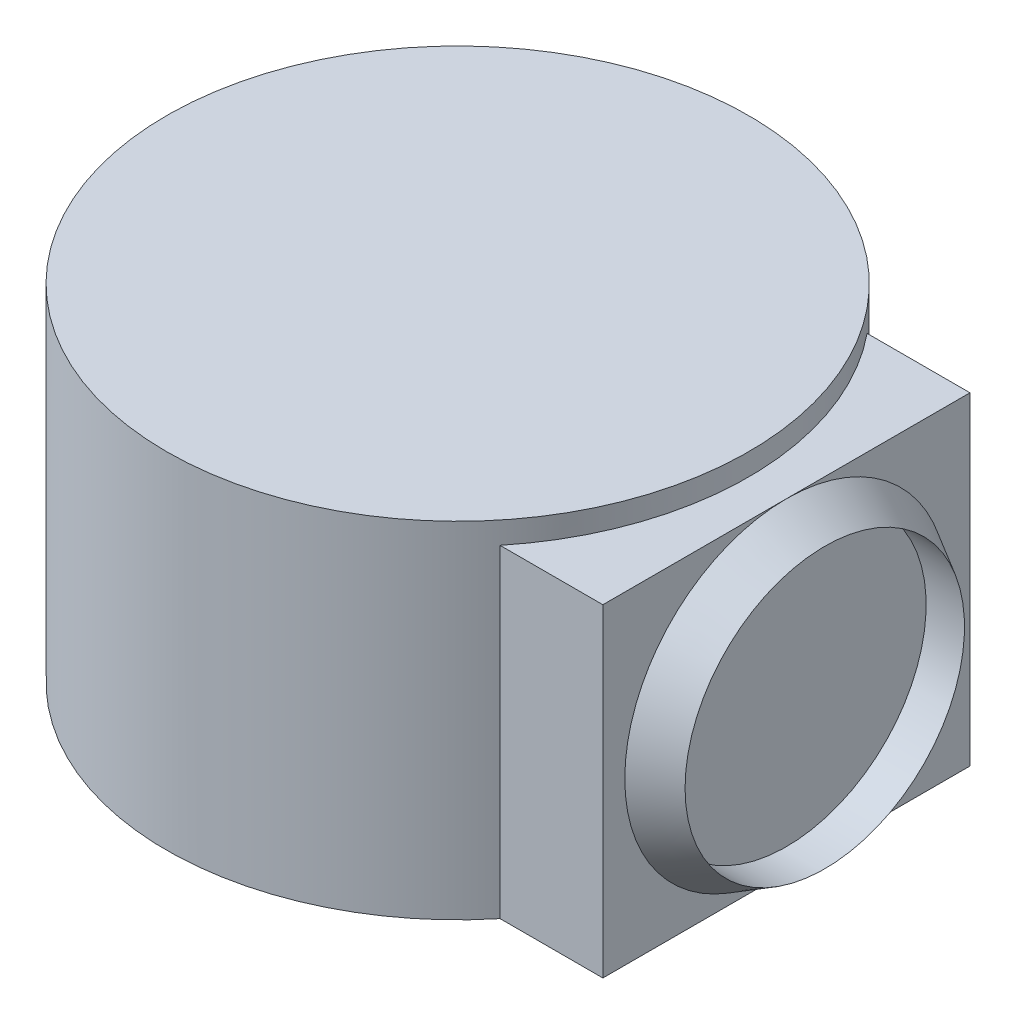
ISO-10303-21;
HEADER;
FILE_DESCRIPTION(('STEP AP214'),'2;1');
FILE_NAME('part.step','',(''),(''),'','','');
FILE_SCHEMA(('AUTOMOTIVE_DESIGN { 1 0 10303 214 1 1 1 1 }'));
ENDSEC;
DATA;
#1=APPLICATION_CONTEXT('core data for automotive mechanical design processes');
#2=APPLICATION_PROTOCOL_DEFINITION('international standard','automotive_design',2000,#1);
#3=PRODUCT_CONTEXT('',#1,'mechanical');
#4=PRODUCT('Part','Part','',(#3));
#5=PRODUCT_RELATED_PRODUCT_CATEGORY('part','',(#4));
#6=PRODUCT_DEFINITION_FORMATION('','',#4);
#7=PRODUCT_DEFINITION_CONTEXT('part definition',#1,'design');
#8=PRODUCT_DEFINITION('design','',#6,#7);
#9=PRODUCT_DEFINITION_SHAPE('','',#8);
#10=(LENGTH_UNIT() NAMED_UNIT(*) SI_UNIT(.MILLI.,.METRE.));
#11=(NAMED_UNIT(*) PLANE_ANGLE_UNIT() SI_UNIT($,.RADIAN.));
#12=(NAMED_UNIT(*) SI_UNIT($,.STERADIAN.) SOLID_ANGLE_UNIT());
#13=UNCERTAINTY_MEASURE_WITH_UNIT(LENGTH_MEASURE(1.E-05),#10,'distance_accuracy_value','');
#14=(GEOMETRIC_REPRESENTATION_CONTEXT(3) GLOBAL_UNCERTAINTY_ASSIGNED_CONTEXT((#13)) GLOBAL_UNIT_ASSIGNED_CONTEXT((#10,
#11,#12)) REPRESENTATION_CONTEXT('',''));
#15=CARTESIAN_POINT('',(0.,0.,0.));
#16=DIRECTION('',(0.,0.,1.));
#17=DIRECTION('',(1.,0.,0.));
#18=AXIS2_PLACEMENT_3D('',#15,#16,#17);
#19=CARTESIAN_POINT('',(0.,147.5,0.));
#20=DIRECTION('',(0.,1.,0.));
#21=DIRECTION('',(0.,0.,1.));
#22=AXIS2_PLACEMENT_3D('',#19,#20,#21);
#23=PLANE('',#22);
#24=DIRECTION('',(-1.,0.,0.));
#25=VECTOR('',#24,1.);
#26=CARTESIAN_POINT('',(150.,147.5,-83.75));
#27=LINE('',#26,#25);
#28=CARTESIAN_POINT('',(150.,147.5,-83.75));
#29=VERTEX_POINT('',#28);
#30=CARTESIAN_POINT('',(103.078114341746,147.5,-83.75));
#31=VERTEX_POINT('',#30);
#32=EDGE_CURVE('E108',#29,#31,#27,.T.);
#33=ORIENTED_EDGE('',*,*,#32,.T.);
#34=CARTESIAN_POINT('',(0.,147.5,0.));
#35=DIRECTION('',(0.,1.,0.));
#36=DIRECTION('',(0.,0.,1.));
#37=AXIS2_PLACEMENT_3D('',#34,#35,#36);
#38=CIRCLE('',#37,132.8125);
#39=CARTESIAN_POINT('',(103.078114341746,147.5,83.75));
#40=VERTEX_POINT('',#39);
#41=EDGE_CURVE('E103',#40,#31,#38,.T.);
#42=ORIENTED_EDGE('',*,*,#41,.F.);
#43=DIRECTION('',(-1.,0.,0.));
#44=VECTOR('',#43,1.);
#45=CARTESIAN_POINT('',(150.,147.5,83.75));
#46=LINE('',#45,#44);
#47=CARTESIAN_POINT('',(150.,147.5,83.75));
#48=VERTEX_POINT('',#47);
#49=EDGE_CURVE('E89',#48,#40,#46,.T.);
#50=ORIENTED_EDGE('',*,*,#49,.F.);
#51=DIRECTION('',(0.,0.,1.));
#52=VECTOR('',#51,1.);
#53=CARTESIAN_POINT('',(150.,147.5,-83.75));
#54=LINE('',#53,#52);
#55=CARTESIAN_POINT('',(150.,147.5,0.));
#56=VERTEX_POINT('',#55);
#57=EDGE_CURVE('E124',#56,#48,#54,.T.);
#58=ORIENTED_EDGE('',*,*,#57,.F.);
#59=EDGE_CURVE('E125',#29,#56,#54,.T.);
#60=ORIENTED_EDGE('',*,*,#59,.F.);
#61=EDGE_LOOP('',(#33,#42,#50,#58,#60));
#62=FACE_BOUND('',#61,.T.);
#63=ADVANCED_FACE('F39',(#62),#23,.T.);
#64=CARTESIAN_POINT('',(150.,0.,0.));
#65=DIRECTION('',(1.,0.,0.));
#66=DIRECTION('',(0.,0.,-1.));
#67=AXIS2_PLACEMENT_3D('',#64,#65,#66);
#68=PLANE('',#67);
#69=ORIENTED_EDGE('',*,*,#59,.T.);
#70=CARTESIAN_POINT('',(150.,73.75,0.));
#71=DIRECTION('',(-1.,0.,0.));
#72=DIRECTION('',(0.,0.,1.));
#73=AXIS2_PLACEMENT_3D('',#70,#71,#72);
#74=CIRCLE('',#73,73.75);
#75=CARTESIAN_POINT('',(150.,0.,0.));
#76=VERTEX_POINT('',#75);
#77=EDGE_CURVE('E51',#56,#76,#74,.T.);
#78=ORIENTED_EDGE('',*,*,#77,.T.);
#79=DIRECTION('',(0.,0.,-1.));
#80=VECTOR('',#79,1.);
#81=CARTESIAN_POINT('',(150.,0.,83.75));
#82=LINE('',#81,#80);
#83=CARTESIAN_POINT('',(150.,0.,-83.75));
#84=VERTEX_POINT('',#83);
#85=EDGE_CURVE('E131',#76,#84,#82,.T.);
#86=ORIENTED_EDGE('',*,*,#85,.T.);
#87=DIRECTION('',(0.,1.,0.));
#88=VECTOR('',#87,1.);
#89=CARTESIAN_POINT('',(150.,0.,-83.75));
#90=LINE('',#89,#88);
#91=EDGE_CURVE('E136',#84,#29,#90,.T.);
#92=ORIENTED_EDGE('',*,*,#91,.T.);
#93=EDGE_LOOP('',(#69,#78,#86,#92));
#94=FACE_BOUND('',#93,.T.);
#95=ADVANCED_FACE('F162',(#94),#68,.T.);
#96=CARTESIAN_POINT('',(0.,147.5,0.));
#97=DIRECTION('',(0.,-1.,0.));
#98=DIRECTION('',(0.,0.,-1.));
#99=AXIS2_PLACEMENT_3D('',#96,#97,#98);
#100=CYLINDRICAL_SURFACE('',#99,132.8125);
#101=DIRECTION('',(0.,-1.,0.));
#102=VECTOR('',#101,1.);
#103=CARTESIAN_POINT('',(103.078114341746,147.5,83.75));
#104=LINE('',#103,#102);
#105=CARTESIAN_POINT('',(103.078114341746,0.,83.75));
#106=VERTEX_POINT('',#105);
#107=EDGE_CURVE('E93',#40,#106,#104,.T.);
#108=ORIENTED_EDGE('',*,*,#107,.F.);
#109=ORIENTED_EDGE('',*,*,#41,.T.);
#110=DIRECTION('',(0.,-1.,0.));
#111=VECTOR('',#110,1.);
#112=CARTESIAN_POINT('',(103.078114341746,147.5,-83.75));
#113=LINE('',#112,#111);
#114=CARTESIAN_POINT('',(103.078114341746,0.,-83.75));
#115=VERTEX_POINT('',#114);
#116=EDGE_CURVE('E63',#115,#31,#113,.F.);
#117=ORIENTED_EDGE('',*,*,#116,.F.);
#118=CARTESIAN_POINT('',(0.,0.,0.));
#119=DIRECTION('',(0.,1.,0.));
#120=DIRECTION('',(0.,0.,1.));
#121=AXIS2_PLACEMENT_3D('',#118,#119,#120);
#122=CIRCLE('',#121,132.8125);
#123=EDGE_CURVE('E43',#115,#106,#122,.T.);
#124=ORIENTED_EDGE('',*,*,#123,.T.);
#125=EDGE_LOOP('',(#108,#109,#117,#124));
#126=FACE_BOUND('',#125,.T.);
#127=CARTESIAN_POINT('',(0.,157.5,0.));
#128=DIRECTION('',(0.,1.,0.));
#129=DIRECTION('',(0.,0.,1.));
#130=AXIS2_PLACEMENT_3D('',#127,#128,#129);
#131=CIRCLE('',#130,132.8125);
#132=CARTESIAN_POINT('',(0.,157.5,132.8125));
#133=VERTEX_POINT('',#132);
#134=EDGE_CURVE('E110',#133,#133,#131,.T.);
#135=ORIENTED_EDGE('',*,*,#134,.F.);
#136=EDGE_LOOP('',(#135));
#137=FACE_BOUND('',#136,.T.);
#138=ADVANCED_FACE('F41',(#126,#137),#100,.T.);
#139=CARTESIAN_POINT('',(0.,0.,0.));
#140=DIRECTION('',(0.,1.,0.));
#141=DIRECTION('',(0.,0.,1.));
#142=AXIS2_PLACEMENT_3D('',#139,#140,#141);
#143=PLANE('',#142);
#144=ORIENTED_EDGE('',*,*,#123,.F.);
#145=DIRECTION('',(-1.,0.,0.));
#146=VECTOR('',#145,1.);
#147=CARTESIAN_POINT('',(150.,0.,-83.75));
#148=LINE('',#147,#146);
#149=EDGE_CURVE('E141',#84,#115,#148,.T.);
#150=ORIENTED_EDGE('',*,*,#149,.F.);
#151=ORIENTED_EDGE('',*,*,#85,.F.);
#152=CARTESIAN_POINT('',(150.,0.,83.75));
#153=VERTEX_POINT('',#152);
#154=EDGE_CURVE('E132',#153,#76,#82,.T.);
#155=ORIENTED_EDGE('',*,*,#154,.F.);
#156=DIRECTION('',(-1.,0.,0.));
#157=VECTOR('',#156,1.);
#158=CARTESIAN_POINT('',(150.,0.,83.75));
#159=LINE('',#158,#157);
#160=EDGE_CURVE('E100',#153,#106,#159,.T.);
#161=ORIENTED_EDGE('',*,*,#160,.T.);
#162=EDGE_LOOP('',(#144,#150,#151,#155,#161));
#163=FACE_BOUND('',#162,.T.);
#164=ADVANCED_FACE('F154',(#163),#143,.F.);
#165=CARTESIAN_POINT('',(150.,147.5,83.75));
#166=DIRECTION('',(0.,0.,-1.));
#167=DIRECTION('',(0.,1.,0.));
#168=AXIS2_PLACEMENT_3D('',#165,#166,#167);
#169=PLANE('',#168);
#170=ORIENTED_EDGE('',*,*,#49,.T.);
#171=ORIENTED_EDGE('',*,*,#107,.T.);
#172=ORIENTED_EDGE('',*,*,#160,.F.);
#173=DIRECTION('',(0.,-1.,0.));
#174=VECTOR('',#173,1.);
#175=CARTESIAN_POINT('',(150.,147.5,83.75));
#176=LINE('',#175,#174);
#177=EDGE_CURVE('E95',#48,#153,#176,.T.);
#178=ORIENTED_EDGE('',*,*,#177,.F.);
#179=EDGE_LOOP('',(#170,#171,#172,#178));
#180=FACE_BOUND('',#179,.T.);
#181=ADVANCED_FACE('F91',(#180),#169,.F.);
#182=CARTESIAN_POINT('',(150.,0.,-83.75));
#183=DIRECTION('',(0.,0.,1.));
#184=DIRECTION('',(1.,0.,0.));
#185=AXIS2_PLACEMENT_3D('',#182,#183,#184);
#186=PLANE('',#185);
#187=ORIENTED_EDGE('',*,*,#149,.T.);
#188=ORIENTED_EDGE('',*,*,#116,.T.);
#189=ORIENTED_EDGE('',*,*,#32,.F.);
#190=ORIENTED_EDGE('',*,*,#91,.F.);
#191=EDGE_LOOP('',(#187,#188,#189,#190));
#192=FACE_BOUND('',#191,.T.);
#193=ADVANCED_FACE('F149',(#192),#186,.F.);
#194=ORIENTED_EDGE('',*,*,#154,.T.);
#195=EDGE_CURVE('E11',#76,#56,#74,.T.);
#196=ORIENTED_EDGE('',*,*,#195,.T.);
#197=ORIENTED_EDGE('',*,*,#57,.T.);
#198=ORIENTED_EDGE('',*,*,#177,.T.);
#199=EDGE_LOOP('',(#194,#196,#197,#198));
#200=FACE_BOUND('',#199,.T.);
#201=ADVANCED_FACE('F158',(#200),#68,.T.);
#202=CARTESIAN_POINT('',(150.,73.75,0.));
#203=DIRECTION('',(-1.,0.,0.));
#204=DIRECTION('',(0.,0.,1.));
#205=AXIS2_PLACEMENT_3D('',#202,#203,#204);
#206=CONICAL_SURFACE('',#205,73.75,0.519146114246523);
#207=CARTESIAN_POINT('',(167.5,73.75,0.));
#208=DIRECTION('',(-1.,0.,0.));
#209=DIRECTION('',(0.,0.,1.));
#210=AXIS2_PLACEMENT_3D('',#207,#208,#209);
#211=CIRCLE('',#210,63.75);
#212=CARTESIAN_POINT('',(167.5,73.75,63.75));
#213=VERTEX_POINT('',#212);
#214=EDGE_CURVE('E114',#213,#213,#211,.T.);
#215=ORIENTED_EDGE('',*,*,#214,.T.);
#216=EDGE_LOOP('',(#215));
#217=FACE_BOUND('',#216,.T.);
#218=ORIENTED_EDGE('',*,*,#77,.F.);
#219=ORIENTED_EDGE('',*,*,#195,.F.);
#220=EDGE_LOOP('',(#218,#219));
#221=FACE_BOUND('',#220,.T.);
#222=ADVANCED_FACE('F179',(#217,#221),#206,.T.);
#223=CARTESIAN_POINT('',(150.,73.75,0.));
#224=DIRECTION('',(-1.,0.,0.));
#225=DIRECTION('',(0.,0.,1.));
#226=AXIS2_PLACEMENT_3D('',#223,#224,#225);
#227=CYLINDRICAL_SURFACE('',#226,63.75);
#228=CARTESIAN_POINT('',(150.,73.75,0.));
#229=DIRECTION('',(-1.,0.,0.));
#230=DIRECTION('',(0.,0.,1.));
#231=AXIS2_PLACEMENT_3D('',#228,#229,#230);
#232=CIRCLE('',#231,63.75);
#233=CARTESIAN_POINT('',(150.,73.75,63.75));
#234=VERTEX_POINT('',#233);
#235=EDGE_CURVE('E49',#234,#234,#232,.T.);
#236=ORIENTED_EDGE('',*,*,#235,.T.);
#237=EDGE_LOOP('',(#236));
#238=FACE_BOUND('',#237,.T.);
#239=ORIENTED_EDGE('',*,*,#214,.F.);
#240=EDGE_LOOP('',(#239));
#241=FACE_BOUND('',#240,.T.);
#242=ADVANCED_FACE('F176',(#238,#241),#227,.F.);
#243=ORIENTED_EDGE('',*,*,#235,.F.);
#244=EDGE_LOOP('',(#243));
#245=FACE_BOUND('',#244,.T.);
#246=ADVANCED_FACE('F165',(#245),#68,.T.);
#247=CARTESIAN_POINT('',(0.,157.5,0.));
#248=DIRECTION('',(0.,1.,0.));
#249=DIRECTION('',(0.,0.,1.));
#250=AXIS2_PLACEMENT_3D('',#247,#248,#249);
#251=PLANE('',#250);
#252=ORIENTED_EDGE('',*,*,#134,.T.);
#253=EDGE_LOOP('',(#252));
#254=FACE_BOUND('',#253,.T.);
#255=ADVANCED_FACE('F175',(#254),#251,.T.);
#256=CLOSED_SHELL('',(#63,#95,#138,#164,#181,#193,#201,#222,#242,#246,#255));
#257=MANIFOLD_SOLID_BREP('B2',#256);
#258=ADVANCED_BREP_SHAPE_REPRESENTATION('',(#18,#257),#14);
#259=SHAPE_DEFINITION_REPRESENTATION(#9,#258);
ENDSEC;
END-ISO-10303-21;
